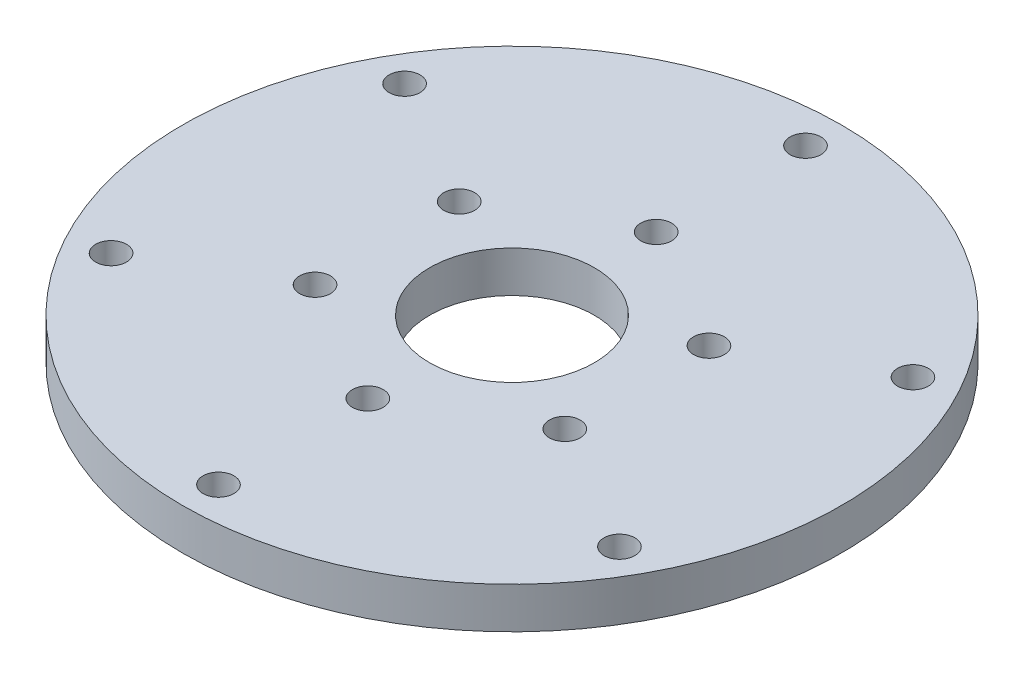
ISO-10303-21;
HEADER;
FILE_DESCRIPTION(('STEP AP214'),'2;1');
FILE_NAME('part.step','',(''),(''),'','','');
FILE_SCHEMA(('AUTOMOTIVE_DESIGN { 1 0 10303 214 1 1 1 1 }'));
ENDSEC;
DATA;
#1=APPLICATION_CONTEXT('core data for automotive mechanical design processes');
#2=APPLICATION_PROTOCOL_DEFINITION('international standard','automotive_design',2000,#1);
#3=PRODUCT_CONTEXT('',#1,'mechanical');
#4=PRODUCT('Part','Part','',(#3));
#5=PRODUCT_RELATED_PRODUCT_CATEGORY('part','',(#4));
#6=PRODUCT_DEFINITION_FORMATION('','',#4);
#7=PRODUCT_DEFINITION_CONTEXT('part definition',#1,'design');
#8=PRODUCT_DEFINITION('design','',#6,#7);
#9=PRODUCT_DEFINITION_SHAPE('','',#8);
#10=(LENGTH_UNIT() NAMED_UNIT(*) SI_UNIT(.MILLI.,.METRE.));
#11=(NAMED_UNIT(*) PLANE_ANGLE_UNIT() SI_UNIT($,.RADIAN.));
#12=(NAMED_UNIT(*) SI_UNIT($,.STERADIAN.) SOLID_ANGLE_UNIT());
#13=UNCERTAINTY_MEASURE_WITH_UNIT(LENGTH_MEASURE(1.E-05),#10,'distance_accuracy_value','');
#14=(GEOMETRIC_REPRESENTATION_CONTEXT(3) GLOBAL_UNCERTAINTY_ASSIGNED_CONTEXT((#13)) GLOBAL_UNIT_ASSIGNED_CONTEXT((#10,
#11,#12)) REPRESENTATION_CONTEXT('',''));
#15=CARTESIAN_POINT('',(0.,0.,0.));
#16=DIRECTION('',(0.,0.,1.));
#17=DIRECTION('',(1.,0.,0.));
#18=AXIS2_PLACEMENT_3D('',#15,#16,#17);
#19=CARTESIAN_POINT('',(0.,4.,0.));
#20=DIRECTION('',(0.,1.,0.));
#21=DIRECTION('',(0.,0.,1.));
#22=AXIS2_PLACEMENT_3D('',#19,#20,#21);
#23=PLANE('',#22);
#24=CARTESIAN_POINT('',(-12.124355652981,4.,7.00000000000069));
#25=DIRECTION('',(0.,1.,0.));
#26=DIRECTION('',(0.,0.,1.));
#27=AXIS2_PLACEMENT_3D('',#24,#25,#26);
#28=CIRCLE('',#27,1.50000000000147);
#29=CARTESIAN_POINT('',(-12.124355652981,4.,8.50000000000216));
#30=VERTEX_POINT('',#29);
#31=EDGE_CURVE('E111',#30,#30,#28,.T.);
#32=ORIENTED_EDGE('',*,*,#31,.F.);
#33=EDGE_LOOP('',(#32));
#34=FACE_BOUND('',#33,.T.);
#35=CARTESIAN_POINT('',(-24.6817240078547,4.,14.2500000000011));
#36=DIRECTION('',(0.,1.,0.));
#37=DIRECTION('',(0.,0.,1.));
#38=AXIS2_PLACEMENT_3D('',#35,#36,#37);
#39=CIRCLE('',#38,1.5);
#40=CARTESIAN_POINT('',(-24.6817240078547,4.,15.7500000000011));
#41=VERTEX_POINT('',#40);
#42=EDGE_CURVE('E99',#41,#41,#39,.T.);
#43=ORIENTED_EDGE('',*,*,#42,.F.);
#44=EDGE_LOOP('',(#43));
#45=FACE_BOUND('',#44,.T.);
#46=CARTESIAN_POINT('',(24.6817240078583,4.,14.2499999999989));
#47=DIRECTION('',(0.,1.,0.));
#48=DIRECTION('',(0.,0.,1.));
#49=AXIS2_PLACEMENT_3D('',#46,#47,#48);
#50=CIRCLE('',#49,1.5);
#51=CARTESIAN_POINT('',(24.6817240078583,4.,15.7499999999989));
#52=VERTEX_POINT('',#51);
#53=EDGE_CURVE('E87',#52,#52,#50,.T.);
#54=ORIENTED_EDGE('',*,*,#53,.F.);
#55=EDGE_LOOP('',(#54));
#56=FACE_BOUND('',#55,.T.);
#57=CARTESIAN_POINT('',(1.58647221154621E-12,4.,14.));
#58=DIRECTION('',(0.,1.,0.));
#59=DIRECTION('',(0.,0.,1.));
#60=AXIS2_PLACEMENT_3D('',#57,#58,#59);
#61=CIRCLE('',#60,1.50000000000123);
#62=CARTESIAN_POINT('',(1.58647221154621E-12,4.,15.5000000000012));
#63=VERTEX_POINT('',#62);
#64=EDGE_CURVE('E75',#63,#63,#61,.T.);
#65=ORIENTED_EDGE('',*,*,#64,.F.);
#66=EDGE_LOOP('',(#65));
#67=FACE_BOUND('',#66,.T.);
#68=CARTESIAN_POINT('',(12.1243556529825,4.,-7.00000000000069));
#69=DIRECTION('',(0.,1.,0.));
#70=DIRECTION('',(0.,0.,1.));
#71=AXIS2_PLACEMENT_3D('',#68,#69,#70);
#72=CIRCLE('',#71,1.50000000000002);
#73=CARTESIAN_POINT('',(12.1243556529825,4.,-5.50000000000067));
#74=VERTEX_POINT('',#73);
#75=EDGE_CURVE('E63',#74,#74,#72,.T.);
#76=ORIENTED_EDGE('',*,*,#75,.F.);
#77=EDGE_LOOP('',(#76));
#78=FACE_BOUND('',#77,.T.);
#79=CARTESIAN_POINT('',(0.,4.,-14.));
#80=DIRECTION('',(0.,1.,0.));
#81=DIRECTION('',(0.,0.,1.));
#82=AXIS2_PLACEMENT_3D('',#79,#80,#81);
#83=CIRCLE('',#82,1.5);
#84=CARTESIAN_POINT('',(0.,4.,-12.5));
#85=VERTEX_POINT('',#84);
#86=EDGE_CURVE('E51',#85,#85,#83,.T.);
#87=ORIENTED_EDGE('',*,*,#86,.F.);
#88=EDGE_LOOP('',(#87));
#89=FACE_BOUND('',#88,.T.);
#90=CARTESIAN_POINT('',(0.,4.,0.));
#91=DIRECTION('',(0.,1.,0.));
#92=DIRECTION('',(0.,0.,1.));
#93=AXIS2_PLACEMENT_3D('',#90,#91,#92);
#94=CIRCLE('',#93,32.);
#95=CARTESIAN_POINT('',(0.,4.,32.));
#96=VERTEX_POINT('',#95);
#97=EDGE_CURVE('E10',#96,#96,#94,.T.);
#98=ORIENTED_EDGE('',*,*,#97,.T.);
#99=EDGE_LOOP('',(#98));
#100=FACE_BOUND('',#99,.T.);
#101=CARTESIAN_POINT('',(0.,4.,0.));
#102=DIRECTION('',(0.,1.,0.));
#103=DIRECTION('',(0.,0.,1.));
#104=AXIS2_PLACEMENT_3D('',#101,#102,#103);
#105=CIRCLE('',#104,8.);
#106=CARTESIAN_POINT('',(0.,4.,8.));
#107=VERTEX_POINT('',#106);
#108=EDGE_CURVE('E46',#107,#107,#105,.T.);
#109=ORIENTED_EDGE('',*,*,#108,.F.);
#110=EDGE_LOOP('',(#109));
#111=FACE_BOUND('',#110,.T.);
#112=CARTESIAN_POINT('',(0.,4.,-28.5));
#113=DIRECTION('',(0.,1.,0.));
#114=DIRECTION('',(0.,0.,1.));
#115=AXIS2_PLACEMENT_3D('',#112,#113,#114);
#116=CIRCLE('',#115,1.5);
#117=CARTESIAN_POINT('',(0.,4.,-27.));
#118=VERTEX_POINT('',#117);
#119=EDGE_CURVE('E57',#118,#118,#116,.T.);
#120=ORIENTED_EDGE('',*,*,#119,.F.);
#121=EDGE_LOOP('',(#120));
#122=FACE_BOUND('',#121,.T.);
#123=CARTESIAN_POINT('',(12.1243556529833,4.,6.99999999999931));
#124=DIRECTION('',(0.,1.,0.));
#125=DIRECTION('',(0.,0.,1.));
#126=AXIS2_PLACEMENT_3D('',#123,#124,#125);
#127=CIRCLE('',#126,1.50000000000128);
#128=CARTESIAN_POINT('',(12.1243556529833,4.,8.50000000000059));
#129=VERTEX_POINT('',#128);
#130=EDGE_CURVE('E69',#129,#129,#127,.T.);
#131=ORIENTED_EDGE('',*,*,#130,.F.);
#132=EDGE_LOOP('',(#131));
#133=FACE_BOUND('',#132,.T.);
#134=CARTESIAN_POINT('',(24.6817240078571,4.,-14.2500000000011));
#135=DIRECTION('',(0.,1.,0.));
#136=DIRECTION('',(0.,0.,1.));
#137=AXIS2_PLACEMENT_3D('',#134,#135,#136);
#138=CIRCLE('',#137,1.5);
#139=CARTESIAN_POINT('',(24.6817240078571,4.,-12.7500000000011));
#140=VERTEX_POINT('',#139);
#141=EDGE_CURVE('E81',#140,#140,#138,.T.);
#142=ORIENTED_EDGE('',*,*,#141,.F.);
#143=EDGE_LOOP('',(#142));
#144=FACE_BOUND('',#143,.T.);
#145=CARTESIAN_POINT('',(2.41958542616683E-12,4.,28.5));
#146=DIRECTION('',(0.,1.,0.));
#147=DIRECTION('',(0.,0.,1.));
#148=AXIS2_PLACEMENT_3D('',#145,#146,#147);
#149=CIRCLE('',#148,1.5);
#150=CARTESIAN_POINT('',(2.41958542616683E-12,4.,30.));
#151=VERTEX_POINT('',#150);
#152=EDGE_CURVE('E93',#151,#151,#149,.T.);
#153=ORIENTED_EDGE('',*,*,#152,.F.);
#154=EDGE_LOOP('',(#153));
#155=FACE_BOUND('',#154,.T.);
#156=CARTESIAN_POINT('',(-24.6817240078559,4.,-14.2499999999989));
#157=DIRECTION('',(0.,1.,0.));
#158=DIRECTION('',(0.,0.,1.));
#159=AXIS2_PLACEMENT_3D('',#156,#157,#158);
#160=CIRCLE('',#159,1.5);
#161=CARTESIAN_POINT('',(-24.6817240078559,4.,-12.7499999999989));
#162=VERTEX_POINT('',#161);
#163=EDGE_CURVE('E105',#162,#162,#160,.T.);
#164=ORIENTED_EDGE('',*,*,#163,.F.);
#165=EDGE_LOOP('',(#164));
#166=FACE_BOUND('',#165,.T.);
#167=CARTESIAN_POINT('',(-12.1243556529818,4.,-6.9999999999993));
#168=DIRECTION('',(0.,1.,0.));
#169=DIRECTION('',(0.,0.,1.));
#170=AXIS2_PLACEMENT_3D('',#167,#168,#169);
#171=CIRCLE('',#170,1.50000000000075);
#172=CARTESIAN_POINT('',(-12.1243556529818,4.,-5.49999999999856));
#173=VERTEX_POINT('',#172);
#174=EDGE_CURVE('E117',#173,#173,#171,.T.);
#175=ORIENTED_EDGE('',*,*,#174,.F.);
#176=EDGE_LOOP('',(#175));
#177=FACE_BOUND('',#176,.T.);
#178=ADVANCED_FACE('F35',(#34,#45,#56,#67,#78,#89,#100,#111,#122,#133,#144,#155,#166,#177),#23,.T.);
#179=CARTESIAN_POINT('',(0.,0.,0.));
#180=DIRECTION('',(0.,1.,0.));
#181=DIRECTION('',(0.,0.,1.));
#182=AXIS2_PLACEMENT_3D('',#179,#180,#181);
#183=PLANE('',#182);
#184=CARTESIAN_POINT('',(0.,0.,0.));
#185=DIRECTION('',(0.,1.,0.));
#186=DIRECTION('',(0.,0.,1.));
#187=AXIS2_PLACEMENT_3D('',#184,#185,#186);
#188=CIRCLE('',#187,32.);
#189=CARTESIAN_POINT('',(0.,0.,32.));
#190=VERTEX_POINT('',#189);
#191=EDGE_CURVE('E39',#190,#190,#188,.T.);
#192=ORIENTED_EDGE('',*,*,#191,.F.);
#193=EDGE_LOOP('',(#192));
#194=FACE_BOUND('',#193,.T.);
#195=CARTESIAN_POINT('',(0.,0.,0.));
#196=DIRECTION('',(0.,1.,0.));
#197=DIRECTION('',(0.,0.,1.));
#198=AXIS2_PLACEMENT_3D('',#195,#196,#197);
#199=CIRCLE('',#198,8.);
#200=CARTESIAN_POINT('',(0.,0.,8.));
#201=VERTEX_POINT('',#200);
#202=EDGE_CURVE('E48',#201,#201,#199,.T.);
#203=ORIENTED_EDGE('',*,*,#202,.T.);
#204=EDGE_LOOP('',(#203));
#205=FACE_BOUND('',#204,.T.);
#206=CARTESIAN_POINT('',(0.,0.,-14.));
#207=DIRECTION('',(0.,1.,0.));
#208=DIRECTION('',(0.,0.,1.));
#209=AXIS2_PLACEMENT_3D('',#206,#207,#208);
#210=CIRCLE('',#209,1.5);
#211=CARTESIAN_POINT('',(0.,0.,-12.5));
#212=VERTEX_POINT('',#211);
#213=EDGE_CURVE('E54',#212,#212,#210,.T.);
#214=ORIENTED_EDGE('',*,*,#213,.T.);
#215=EDGE_LOOP('',(#214));
#216=FACE_BOUND('',#215,.T.);
#217=CARTESIAN_POINT('',(0.,0.,-28.5));
#218=DIRECTION('',(0.,1.,0.));
#219=DIRECTION('',(0.,0.,1.));
#220=AXIS2_PLACEMENT_3D('',#217,#218,#219);
#221=CIRCLE('',#220,1.5);
#222=CARTESIAN_POINT('',(0.,0.,-27.));
#223=VERTEX_POINT('',#222);
#224=EDGE_CURVE('E60',#223,#223,#221,.T.);
#225=ORIENTED_EDGE('',*,*,#224,.T.);
#226=EDGE_LOOP('',(#225));
#227=FACE_BOUND('',#226,.T.);
#228=CARTESIAN_POINT('',(12.1243556529825,0.,-7.00000000000069));
#229=DIRECTION('',(0.,1.,0.));
#230=DIRECTION('',(0.,0.,1.));
#231=AXIS2_PLACEMENT_3D('',#228,#229,#230);
#232=CIRCLE('',#231,1.50000000000002);
#233=CARTESIAN_POINT('',(12.1243556529825,0.,-5.50000000000067));
#234=VERTEX_POINT('',#233);
#235=EDGE_CURVE('E66',#234,#234,#232,.T.);
#236=ORIENTED_EDGE('',*,*,#235,.T.);
#237=EDGE_LOOP('',(#236));
#238=FACE_BOUND('',#237,.T.);
#239=CARTESIAN_POINT('',(12.1243556529833,0.,6.99999999999931));
#240=DIRECTION('',(0.,1.,0.));
#241=DIRECTION('',(0.,0.,1.));
#242=AXIS2_PLACEMENT_3D('',#239,#240,#241);
#243=CIRCLE('',#242,1.50000000000128);
#244=CARTESIAN_POINT('',(12.1243556529833,0.,8.50000000000059));
#245=VERTEX_POINT('',#244);
#246=EDGE_CURVE('E72',#245,#245,#243,.T.);
#247=ORIENTED_EDGE('',*,*,#246,.T.);
#248=EDGE_LOOP('',(#247));
#249=FACE_BOUND('',#248,.T.);
#250=CARTESIAN_POINT('',(1.58647221154621E-12,0.,14.));
#251=DIRECTION('',(0.,1.,0.));
#252=DIRECTION('',(0.,0.,1.));
#253=AXIS2_PLACEMENT_3D('',#250,#251,#252);
#254=CIRCLE('',#253,1.50000000000123);
#255=CARTESIAN_POINT('',(1.58647221154621E-12,0.,15.5000000000012));
#256=VERTEX_POINT('',#255);
#257=EDGE_CURVE('E78',#256,#256,#254,.T.);
#258=ORIENTED_EDGE('',*,*,#257,.T.);
#259=EDGE_LOOP('',(#258));
#260=FACE_BOUND('',#259,.T.);
#261=CARTESIAN_POINT('',(24.6817240078571,0.,-14.2500000000011));
#262=DIRECTION('',(0.,1.,0.));
#263=DIRECTION('',(0.,0.,1.));
#264=AXIS2_PLACEMENT_3D('',#261,#262,#263);
#265=CIRCLE('',#264,1.5);
#266=CARTESIAN_POINT('',(24.6817240078571,0.,-12.7500000000011));
#267=VERTEX_POINT('',#266);
#268=EDGE_CURVE('E84',#267,#267,#265,.T.);
#269=ORIENTED_EDGE('',*,*,#268,.T.);
#270=EDGE_LOOP('',(#269));
#271=FACE_BOUND('',#270,.T.);
#272=CARTESIAN_POINT('',(24.6817240078583,0.,14.2499999999989));
#273=DIRECTION('',(0.,1.,0.));
#274=DIRECTION('',(0.,0.,1.));
#275=AXIS2_PLACEMENT_3D('',#272,#273,#274);
#276=CIRCLE('',#275,1.5);
#277=CARTESIAN_POINT('',(24.6817240078583,0.,15.7499999999989));
#278=VERTEX_POINT('',#277);
#279=EDGE_CURVE('E90',#278,#278,#276,.T.);
#280=ORIENTED_EDGE('',*,*,#279,.T.);
#281=EDGE_LOOP('',(#280));
#282=FACE_BOUND('',#281,.T.);
#283=CARTESIAN_POINT('',(2.41958542616683E-12,0.,28.5));
#284=DIRECTION('',(0.,1.,0.));
#285=DIRECTION('',(0.,0.,1.));
#286=AXIS2_PLACEMENT_3D('',#283,#284,#285);
#287=CIRCLE('',#286,1.5);
#288=CARTESIAN_POINT('',(2.41958542616683E-12,0.,30.));
#289=VERTEX_POINT('',#288);
#290=EDGE_CURVE('E96',#289,#289,#287,.T.);
#291=ORIENTED_EDGE('',*,*,#290,.T.);
#292=EDGE_LOOP('',(#291));
#293=FACE_BOUND('',#292,.T.);
#294=CARTESIAN_POINT('',(-24.6817240078547,0.,14.2500000000011));
#295=DIRECTION('',(0.,1.,0.));
#296=DIRECTION('',(0.,0.,1.));
#297=AXIS2_PLACEMENT_3D('',#294,#295,#296);
#298=CIRCLE('',#297,1.5);
#299=CARTESIAN_POINT('',(-24.6817240078547,0.,15.7500000000011));
#300=VERTEX_POINT('',#299);
#301=EDGE_CURVE('E102',#300,#300,#298,.T.);
#302=ORIENTED_EDGE('',*,*,#301,.T.);
#303=EDGE_LOOP('',(#302));
#304=FACE_BOUND('',#303,.T.);
#305=CARTESIAN_POINT('',(-24.6817240078559,0.,-14.2499999999989));
#306=DIRECTION('',(0.,1.,0.));
#307=DIRECTION('',(0.,0.,1.));
#308=AXIS2_PLACEMENT_3D('',#305,#306,#307);
#309=CIRCLE('',#308,1.5);
#310=CARTESIAN_POINT('',(-24.6817240078559,0.,-12.7499999999989));
#311=VERTEX_POINT('',#310);
#312=EDGE_CURVE('E108',#311,#311,#309,.T.);
#313=ORIENTED_EDGE('',*,*,#312,.T.);
#314=EDGE_LOOP('',(#313));
#315=FACE_BOUND('',#314,.T.);
#316=CARTESIAN_POINT('',(-12.124355652981,0.,7.00000000000069));
#317=DIRECTION('',(0.,1.,0.));
#318=DIRECTION('',(0.,0.,1.));
#319=AXIS2_PLACEMENT_3D('',#316,#317,#318);
#320=CIRCLE('',#319,1.50000000000147);
#321=CARTESIAN_POINT('',(-12.124355652981,0.,8.50000000000216));
#322=VERTEX_POINT('',#321);
#323=EDGE_CURVE('E114',#322,#322,#320,.T.);
#324=ORIENTED_EDGE('',*,*,#323,.T.);
#325=EDGE_LOOP('',(#324));
#326=FACE_BOUND('',#325,.T.);
#327=CARTESIAN_POINT('',(-12.1243556529818,0.,-6.9999999999993));
#328=DIRECTION('',(0.,1.,0.));
#329=DIRECTION('',(0.,0.,1.));
#330=AXIS2_PLACEMENT_3D('',#327,#328,#329);
#331=CIRCLE('',#330,1.50000000000075);
#332=CARTESIAN_POINT('',(-12.1243556529818,0.,-5.49999999999856));
#333=VERTEX_POINT('',#332);
#334=EDGE_CURVE('E120',#333,#333,#331,.T.);
#335=ORIENTED_EDGE('',*,*,#334,.T.);
#336=EDGE_LOOP('',(#335));
#337=FACE_BOUND('',#336,.T.);
#338=ADVANCED_FACE('F130',(#194,#205,#216,#227,#238,#249,#260,#271,#282,#293,#304,#315,#326,
#337),#183,.F.);
#339=CARTESIAN_POINT('',(0.,4.,0.));
#340=DIRECTION('',(0.,-1.,0.));
#341=DIRECTION('',(0.,0.,-1.));
#342=AXIS2_PLACEMENT_3D('',#339,#340,#341);
#343=CYLINDRICAL_SURFACE('',#342,32.);
#344=ORIENTED_EDGE('',*,*,#97,.F.);
#345=EDGE_LOOP('',(#344));
#346=FACE_BOUND('',#345,.T.);
#347=ORIENTED_EDGE('',*,*,#191,.T.);
#348=EDGE_LOOP('',(#347));
#349=FACE_BOUND('',#348,.T.);
#350=ADVANCED_FACE('F37',(#346,#349),#343,.T.);
#351=CARTESIAN_POINT('',(0.,4.,0.));
#352=DIRECTION('',(0.,-1.,0.));
#353=DIRECTION('',(0.,0.,-1.));
#354=AXIS2_PLACEMENT_3D('',#351,#352,#353);
#355=CYLINDRICAL_SURFACE('',#354,8.);
#356=ORIENTED_EDGE('',*,*,#108,.T.);
#357=EDGE_LOOP('',(#356));
#358=FACE_BOUND('',#357,.T.);
#359=ORIENTED_EDGE('',*,*,#202,.F.);
#360=EDGE_LOOP('',(#359));
#361=FACE_BOUND('',#360,.T.);
#362=ADVANCED_FACE('F140',(#358,#361),#355,.F.);
#363=CARTESIAN_POINT('',(0.,4.,-14.));
#364=DIRECTION('',(0.,-1.,0.));
#365=DIRECTION('',(0.,0.,-1.));
#366=AXIS2_PLACEMENT_3D('',#363,#364,#365);
#367=CYLINDRICAL_SURFACE('',#366,1.5);
#368=ORIENTED_EDGE('',*,*,#86,.T.);
#369=EDGE_LOOP('',(#368));
#370=FACE_BOUND('',#369,.T.);
#371=ORIENTED_EDGE('',*,*,#213,.F.);
#372=EDGE_LOOP('',(#371));
#373=FACE_BOUND('',#372,.T.);
#374=ADVANCED_FACE('F143',(#370,#373),#367,.F.);
#375=CARTESIAN_POINT('',(0.,4.,-28.5));
#376=DIRECTION('',(0.,-1.,0.));
#377=DIRECTION('',(0.,0.,-1.));
#378=AXIS2_PLACEMENT_3D('',#375,#376,#377);
#379=CYLINDRICAL_SURFACE('',#378,1.5);
#380=ORIENTED_EDGE('',*,*,#119,.T.);
#381=EDGE_LOOP('',(#380));
#382=FACE_BOUND('',#381,.T.);
#383=ORIENTED_EDGE('',*,*,#224,.F.);
#384=EDGE_LOOP('',(#383));
#385=FACE_BOUND('',#384,.T.);
#386=ADVANCED_FACE('F147',(#382,#385),#379,.F.);
#387=CARTESIAN_POINT('',(12.1243556529825,4.,-7.00000000000069));
#388=DIRECTION('',(0.,-1.,0.));
#389=DIRECTION('',(0.,0.,-1.));
#390=AXIS2_PLACEMENT_3D('',#387,#388,#389);
#391=CYLINDRICAL_SURFACE('',#390,1.50000000000002);
#392=ORIENTED_EDGE('',*,*,#75,.T.);
#393=EDGE_LOOP('',(#392));
#394=FACE_BOUND('',#393,.T.);
#395=ORIENTED_EDGE('',*,*,#235,.F.);
#396=EDGE_LOOP('',(#395));
#397=FACE_BOUND('',#396,.T.);
#398=ADVANCED_FACE('F151',(#394,#397),#391,.F.);
#399=CARTESIAN_POINT('',(12.1243556529833,4.,6.99999999999931));
#400=DIRECTION('',(0.,-1.,0.));
#401=DIRECTION('',(0.,0.,-1.));
#402=AXIS2_PLACEMENT_3D('',#399,#400,#401);
#403=CYLINDRICAL_SURFACE('',#402,1.50000000000128);
#404=ORIENTED_EDGE('',*,*,#130,.T.);
#405=EDGE_LOOP('',(#404));
#406=FACE_BOUND('',#405,.T.);
#407=ORIENTED_EDGE('',*,*,#246,.F.);
#408=EDGE_LOOP('',(#407));
#409=FACE_BOUND('',#408,.T.);
#410=ADVANCED_FACE('F155',(#406,#409),#403,.F.);
#411=CARTESIAN_POINT('',(1.58647221154621E-12,4.,14.));
#412=DIRECTION('',(0.,-1.,0.));
#413=DIRECTION('',(0.,0.,-1.));
#414=AXIS2_PLACEMENT_3D('',#411,#412,#413);
#415=CYLINDRICAL_SURFACE('',#414,1.50000000000123);
#416=ORIENTED_EDGE('',*,*,#64,.T.);
#417=EDGE_LOOP('',(#416));
#418=FACE_BOUND('',#417,.T.);
#419=ORIENTED_EDGE('',*,*,#257,.F.);
#420=EDGE_LOOP('',(#419));
#421=FACE_BOUND('',#420,.T.);
#422=ADVANCED_FACE('F159',(#418,#421),#415,.F.);
#423=CARTESIAN_POINT('',(24.6817240078571,4.,-14.2500000000011));
#424=DIRECTION('',(0.,-1.,0.));
#425=DIRECTION('',(0.,0.,-1.));
#426=AXIS2_PLACEMENT_3D('',#423,#424,#425);
#427=CYLINDRICAL_SURFACE('',#426,1.5);
#428=ORIENTED_EDGE('',*,*,#141,.T.);
#429=EDGE_LOOP('',(#428));
#430=FACE_BOUND('',#429,.T.);
#431=ORIENTED_EDGE('',*,*,#268,.F.);
#432=EDGE_LOOP('',(#431));
#433=FACE_BOUND('',#432,.T.);
#434=ADVANCED_FACE('F163',(#430,#433),#427,.F.);
#435=CARTESIAN_POINT('',(24.6817240078583,4.,14.2499999999989));
#436=DIRECTION('',(0.,-1.,0.));
#437=DIRECTION('',(0.,0.,-1.));
#438=AXIS2_PLACEMENT_3D('',#435,#436,#437);
#439=CYLINDRICAL_SURFACE('',#438,1.5);
#440=ORIENTED_EDGE('',*,*,#53,.T.);
#441=EDGE_LOOP('',(#440));
#442=FACE_BOUND('',#441,.T.);
#443=ORIENTED_EDGE('',*,*,#279,.F.);
#444=EDGE_LOOP('',(#443));
#445=FACE_BOUND('',#444,.T.);
#446=ADVANCED_FACE('F167',(#442,#445),#439,.F.);
#447=CARTESIAN_POINT('',(2.41958542616683E-12,4.,28.5));
#448=DIRECTION('',(0.,-1.,0.));
#449=DIRECTION('',(0.,0.,-1.));
#450=AXIS2_PLACEMENT_3D('',#447,#448,#449);
#451=CYLINDRICAL_SURFACE('',#450,1.5);
#452=ORIENTED_EDGE('',*,*,#152,.T.);
#453=EDGE_LOOP('',(#452));
#454=FACE_BOUND('',#453,.T.);
#455=ORIENTED_EDGE('',*,*,#290,.F.);
#456=EDGE_LOOP('',(#455));
#457=FACE_BOUND('',#456,.T.);
#458=ADVANCED_FACE('F171',(#454,#457),#451,.F.);
#459=CARTESIAN_POINT('',(-24.6817240078547,4.,14.2500000000011));
#460=DIRECTION('',(0.,-1.,0.));
#461=DIRECTION('',(0.,0.,-1.));
#462=AXIS2_PLACEMENT_3D('',#459,#460,#461);
#463=CYLINDRICAL_SURFACE('',#462,1.5);
#464=ORIENTED_EDGE('',*,*,#42,.T.);
#465=EDGE_LOOP('',(#464));
#466=FACE_BOUND('',#465,.T.);
#467=ORIENTED_EDGE('',*,*,#301,.F.);
#468=EDGE_LOOP('',(#467));
#469=FACE_BOUND('',#468,.T.);
#470=ADVANCED_FACE('F175',(#466,#469),#463,.F.);
#471=CARTESIAN_POINT('',(-24.6817240078559,4.,-14.2499999999989));
#472=DIRECTION('',(0.,-1.,0.));
#473=DIRECTION('',(0.,0.,-1.));
#474=AXIS2_PLACEMENT_3D('',#471,#472,#473);
#475=CYLINDRICAL_SURFACE('',#474,1.5);
#476=ORIENTED_EDGE('',*,*,#163,.T.);
#477=EDGE_LOOP('',(#476));
#478=FACE_BOUND('',#477,.T.);
#479=ORIENTED_EDGE('',*,*,#312,.F.);
#480=EDGE_LOOP('',(#479));
#481=FACE_BOUND('',#480,.T.);
#482=ADVANCED_FACE('F179',(#478,#481),#475,.F.);
#483=CARTESIAN_POINT('',(-12.124355652981,4.,7.00000000000069));
#484=DIRECTION('',(0.,-1.,0.));
#485=DIRECTION('',(0.,0.,-1.));
#486=AXIS2_PLACEMENT_3D('',#483,#484,#485);
#487=CYLINDRICAL_SURFACE('',#486,1.50000000000147);
#488=ORIENTED_EDGE('',*,*,#31,.T.);
#489=EDGE_LOOP('',(#488));
#490=FACE_BOUND('',#489,.T.);
#491=ORIENTED_EDGE('',*,*,#323,.F.);
#492=EDGE_LOOP('',(#491));
#493=FACE_BOUND('',#492,.T.);
#494=ADVANCED_FACE('F183',(#490,#493),#487,.F.);
#495=CARTESIAN_POINT('',(-12.1243556529818,4.,-6.9999999999993));
#496=DIRECTION('',(0.,-1.,0.));
#497=DIRECTION('',(0.,0.,-1.));
#498=AXIS2_PLACEMENT_3D('',#495,#496,#497);
#499=CYLINDRICAL_SURFACE('',#498,1.50000000000075);
#500=ORIENTED_EDGE('',*,*,#174,.T.);
#501=EDGE_LOOP('',(#500));
#502=FACE_BOUND('',#501,.T.);
#503=ORIENTED_EDGE('',*,*,#334,.F.);
#504=EDGE_LOOP('',(#503));
#505=FACE_BOUND('',#504,.T.);
#506=ADVANCED_FACE('F126',(#502,#505),#499,.F.);
#507=CLOSED_SHELL('',(#178,#338,#350,#362,#374,#386,#398,#410,#422,#434,#446,#458,#470,#482,
#494,#506));
#508=MANIFOLD_SOLID_BREP('B2',#507);
#509=ADVANCED_BREP_SHAPE_REPRESENTATION('',(#18,#508),#14);
#510=SHAPE_DEFINITION_REPRESENTATION(#9,#509);
ENDSEC;
END-ISO-10303-21;
